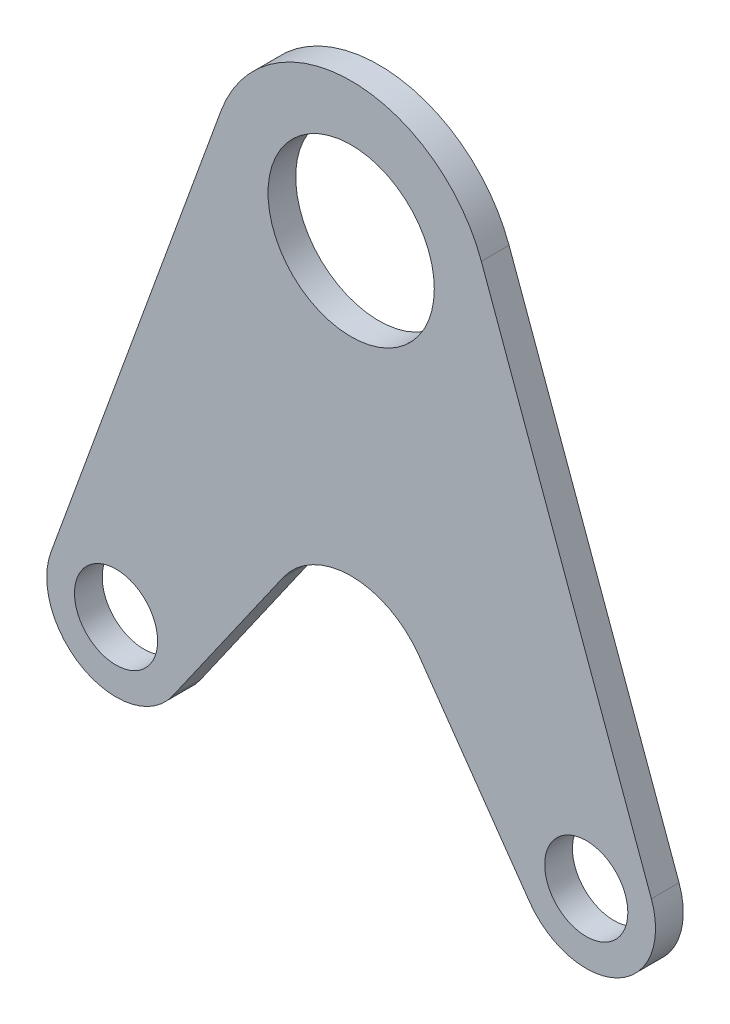
ISO-10303-21;
HEADER;
FILE_DESCRIPTION(('STEP AP214'),'2;1');
FILE_NAME('part.step','',(''),(''),'','','');
FILE_SCHEMA(('AUTOMOTIVE_DESIGN { 1 0 10303 214 1 1 1 1 }'));
ENDSEC;
DATA;
#1=APPLICATION_CONTEXT('core data for automotive mechanical design processes');
#2=APPLICATION_PROTOCOL_DEFINITION('international standard','automotive_design',2000,#1);
#3=PRODUCT_CONTEXT('',#1,'mechanical');
#4=PRODUCT('Part','Part','',(#3));
#5=PRODUCT_RELATED_PRODUCT_CATEGORY('part','',(#4));
#6=PRODUCT_DEFINITION_FORMATION('','',#4);
#7=PRODUCT_DEFINITION_CONTEXT('part definition',#1,'design');
#8=PRODUCT_DEFINITION('design','',#6,#7);
#9=PRODUCT_DEFINITION_SHAPE('','',#8);
#10=(LENGTH_UNIT() NAMED_UNIT(*) SI_UNIT(.MILLI.,.METRE.));
#11=(NAMED_UNIT(*) PLANE_ANGLE_UNIT() SI_UNIT($,.RADIAN.));
#12=(NAMED_UNIT(*) SI_UNIT($,.STERADIAN.) SOLID_ANGLE_UNIT());
#13=UNCERTAINTY_MEASURE_WITH_UNIT(LENGTH_MEASURE(1.E-05),#10,'distance_accuracy_value','');
#14=(GEOMETRIC_REPRESENTATION_CONTEXT(3) GLOBAL_UNCERTAINTY_ASSIGNED_CONTEXT((#13)) GLOBAL_UNIT_ASSIGNED_CONTEXT((#10,
#11,#12)) REPRESENTATION_CONTEXT('',''));
#15=CARTESIAN_POINT('',(0.,0.,0.));
#16=DIRECTION('',(0.,0.,1.));
#17=DIRECTION('',(1.,0.,0.));
#18=AXIS2_PLACEMENT_3D('',#15,#16,#17);
#19=CARTESIAN_POINT('',(0.,0.,10.));
#20=DIRECTION('',(0.,0.,1.));
#21=DIRECTION('',(1.,0.,0.));
#22=AXIS2_PLACEMENT_3D('',#19,#20,#21);
#23=PLANE('',#22);
#24=CARTESIAN_POINT('',(-84.8396817944896,-160.,10.));
#25=DIRECTION('',(0.,0.,1.));
#26=DIRECTION('',(1.,0.,0.));
#27=AXIS2_PLACEMENT_3D('',#24,#25,#26);
#28=CIRCLE('',#27,14.9999999999997);
#29=CARTESIAN_POINT('',(-69.8396817944899,-160.,10.));
#30=VERTEX_POINT('',#29);
#31=EDGE_CURVE('E182',#30,#30,#28,.T.);
#32=ORIENTED_EDGE('',*,*,#31,.F.);
#33=EDGE_LOOP('',(#32));
#34=FACE_BOUND('',#33,.T.);
#35=CARTESIAN_POINT('',(0.,0.,10.));
#36=DIRECTION('',(0.,0.,1.));
#37=DIRECTION('',(1.,0.,0.));
#38=AXIS2_PLACEMENT_3D('',#35,#36,#37);
#39=CIRCLE('',#38,50.);
#40=CARTESIAN_POINT('',(46.9846310392954,17.1010071662835,10.));
#41=VERTEX_POINT('',#40);
#42=CARTESIAN_POINT('',(-46.9846310392955,17.1010071662834,10.));
#43=VERTEX_POINT('',#42);
#44=EDGE_CURVE('E145',#41,#43,#39,.T.);
#45=ORIENTED_EDGE('',*,*,#44,.T.);
#46=DIRECTION('',(-0.342020143325666,-0.939692620785909,0.));
#47=VECTOR('',#46,1.);
#48=CARTESIAN_POINT('',(-46.9846310392955,17.1010071662834,10.));
#49=LINE('',#48,#47);
#50=CARTESIAN_POINT('',(-108.331997314137,-151.449496416858,10.));
#51=VERTEX_POINT('',#50);
#52=EDGE_CURVE('E93',#43,#51,#49,.T.);
#53=ORIENTED_EDGE('',*,*,#52,.T.);
#54=CARTESIAN_POINT('',(-84.8396817944896,-160.,10.));
#55=DIRECTION('',(0.,0.,1.));
#56=DIRECTION('',(1.,0.,0.));
#57=AXIS2_PLACEMENT_3D('',#54,#55,#56);
#58=CIRCLE('',#57,25.);
#59=CARTESIAN_POINT('',(-64.3608806872648,-174.339410908776,10.));
#60=VERTEX_POINT('',#59);
#61=EDGE_CURVE('E160',#51,#60,#58,.T.);
#62=ORIENTED_EDGE('',*,*,#61,.T.);
#63=DIRECTION('',(0.573576436351041,0.819152044288995,0.));
#64=VECTOR('',#63,1.);
#65=CARTESIAN_POINT('',(-64.3608806872648,-174.339410908776,10.));
#66=LINE('',#65,#64);
#67=CARTESIAN_POINT('',(-24.5745613286698,-117.518658221193,10.));
#68=VERTEX_POINT('',#67);
#69=EDGE_CURVE('E173',#60,#68,#66,.T.);
#70=ORIENTED_EDGE('',*,*,#69,.T.);
#71=CARTESIAN_POINT('',(0.,-134.725951311724,10.));
#72=DIRECTION('',(0.,0.,-1.));
#73=DIRECTION('',(-1.,0.,0.));
#74=AXIS2_PLACEMENT_3D('',#71,#72,#73);
#75=CIRCLE('',#74,30.);
#76=CARTESIAN_POINT('',(24.5745613286697,-117.518658221193,10.));
#77=VERTEX_POINT('',#76);
#78=EDGE_CURVE('E112',#68,#77,#75,.T.);
#79=ORIENTED_EDGE('',*,*,#78,.T.);
#80=DIRECTION('',(0.573576436351047,-0.819152044288991,0.));
#81=VECTOR('',#80,1.);
#82=CARTESIAN_POINT('',(24.5745613286697,-117.518658221193,10.));
#83=LINE('',#82,#81);
#84=CARTESIAN_POINT('',(64.3608806872656,-174.339410908776,10.));
#85=VERTEX_POINT('',#84);
#86=EDGE_CURVE('E106',#77,#85,#83,.T.);
#87=ORIENTED_EDGE('',*,*,#86,.T.);
#88=CARTESIAN_POINT('',(84.8396817944903,-160.,10.));
#89=DIRECTION('',(0.,0.,1.));
#90=DIRECTION('',(1.,0.,0.));
#91=AXIS2_PLACEMENT_3D('',#88,#89,#90);
#92=CIRCLE('',#91,25.);
#93=CARTESIAN_POINT('',(108.331997314138,-151.449496416858,10.));
#94=VERTEX_POINT('',#93);
#95=EDGE_CURVE('E110',#85,#94,#92,.T.);
#96=ORIENTED_EDGE('',*,*,#95,.T.);
#97=DIRECTION('',(-0.342020143325669,0.939692620785908,0.));
#98=VECTOR('',#97,1.);
#99=CARTESIAN_POINT('',(46.9846310392954,17.1010071662835,10.));
#100=LINE('',#99,#98);
#101=EDGE_CURVE('E50',#94,#41,#100,.T.);
#102=ORIENTED_EDGE('',*,*,#101,.T.);
#103=EDGE_LOOP('',(#45,#53,#62,#70,#79,#87,#96,#102));
#104=FACE_BOUND('',#103,.T.);
#105=CARTESIAN_POINT('',(0.,0.,10.));
#106=DIRECTION('',(0.,0.,1.));
#107=DIRECTION('',(1.,0.,0.));
#108=AXIS2_PLACEMENT_3D('',#105,#106,#107);
#109=CIRCLE('',#108,30.);
#110=CARTESIAN_POINT('',(30.,0.,10.));
#111=VERTEX_POINT('',#110);
#112=EDGE_CURVE('E134',#111,#111,#109,.T.);
#113=ORIENTED_EDGE('',*,*,#112,.F.);
#114=EDGE_LOOP('',(#113));
#115=FACE_BOUND('',#114,.T.);
#116=CARTESIAN_POINT('',(84.8396817944903,-160.,10.));
#117=DIRECTION('',(0.,0.,1.));
#118=DIRECTION('',(1.,0.,0.));
#119=AXIS2_PLACEMENT_3D('',#116,#117,#118);
#120=CIRCLE('',#119,15.);
#121=CARTESIAN_POINT('',(99.8396817944903,-160.,10.));
#122=VERTEX_POINT('',#121);
#123=EDGE_CURVE('E188',#122,#122,#120,.T.);
#124=ORIENTED_EDGE('',*,*,#123,.F.);
#125=EDGE_LOOP('',(#124));
#126=FACE_BOUND('',#125,.T.);
#127=ADVANCED_FACE('F33',(#34,#104,#115,#126),#23,.T.);
#128=CARTESIAN_POINT('',(0.,0.,0.));
#129=DIRECTION('',(0.,0.,1.));
#130=DIRECTION('',(1.,0.,0.));
#131=AXIS2_PLACEMENT_3D('',#128,#129,#130);
#132=PLANE('',#131);
#133=CARTESIAN_POINT('',(0.,0.,0.));
#134=DIRECTION('',(0.,0.,1.));
#135=DIRECTION('',(1.,0.,0.));
#136=AXIS2_PLACEMENT_3D('',#133,#134,#135);
#137=CIRCLE('',#136,50.);
#138=CARTESIAN_POINT('',(46.9846310392954,17.1010071662835,0.));
#139=VERTEX_POINT('',#138);
#140=CARTESIAN_POINT('',(-46.9846310392955,17.1010071662834,0.));
#141=VERTEX_POINT('',#140);
#142=EDGE_CURVE('E130',#139,#141,#137,.T.);
#143=ORIENTED_EDGE('',*,*,#142,.F.);
#144=DIRECTION('',(-0.342020143325669,0.939692620785908,0.));
#145=VECTOR('',#144,1.);
#146=CARTESIAN_POINT('',(46.9846310392954,17.1010071662835,0.));
#147=LINE('',#146,#145);
#148=CARTESIAN_POINT('',(108.331997314138,-151.449496416858,0.));
#149=VERTEX_POINT('',#148);
#150=EDGE_CURVE('E85',#149,#139,#147,.T.);
#151=ORIENTED_EDGE('',*,*,#150,.F.);
#152=CARTESIAN_POINT('',(84.8396817944903,-160.,0.));
#153=DIRECTION('',(0.,0.,1.));
#154=DIRECTION('',(1.,0.,0.));
#155=AXIS2_PLACEMENT_3D('',#152,#153,#154);
#156=CIRCLE('',#155,25.);
#157=CARTESIAN_POINT('',(64.3608806872656,-174.339410908776,0.));
#158=VERTEX_POINT('',#157);
#159=EDGE_CURVE('E79',#158,#149,#156,.T.);
#160=ORIENTED_EDGE('',*,*,#159,.F.);
#161=DIRECTION('',(0.573576436351047,-0.819152044288991,0.));
#162=VECTOR('',#161,1.);
#163=CARTESIAN_POINT('',(24.5745613286697,-117.518658221193,0.));
#164=LINE('',#163,#162);
#165=CARTESIAN_POINT('',(24.5745613286697,-117.518658221193,0.));
#166=VERTEX_POINT('',#165);
#167=EDGE_CURVE('E120',#166,#158,#164,.T.);
#168=ORIENTED_EDGE('',*,*,#167,.F.);
#169=CARTESIAN_POINT('',(0.,-134.725951311724,0.));
#170=DIRECTION('',(0.,0.,-1.));
#171=DIRECTION('',(-1.,0.,0.));
#172=AXIS2_PLACEMENT_3D('',#169,#170,#171);
#173=CIRCLE('',#172,30.);
#174=CARTESIAN_POINT('',(-24.5745613286698,-117.518658221193,0.));
#175=VERTEX_POINT('',#174);
#176=EDGE_CURVE('E140',#175,#166,#173,.T.);
#177=ORIENTED_EDGE('',*,*,#176,.F.);
#178=DIRECTION('',(0.573576436351041,0.819152044288995,0.));
#179=VECTOR('',#178,1.);
#180=CARTESIAN_POINT('',(-64.3608806872648,-174.339410908776,0.));
#181=LINE('',#180,#179);
#182=CARTESIAN_POINT('',(-64.3608806872648,-174.339410908776,0.));
#183=VERTEX_POINT('',#182);
#184=EDGE_CURVE('E138',#183,#175,#181,.T.);
#185=ORIENTED_EDGE('',*,*,#184,.F.);
#186=CARTESIAN_POINT('',(-84.8396817944896,-160.,0.));
#187=DIRECTION('',(0.,0.,1.));
#188=DIRECTION('',(1.,0.,0.));
#189=AXIS2_PLACEMENT_3D('',#186,#187,#188);
#190=CIRCLE('',#189,25.);
#191=CARTESIAN_POINT('',(-108.331997314137,-151.449496416858,0.));
#192=VERTEX_POINT('',#191);
#193=EDGE_CURVE('E136',#192,#183,#190,.T.);
#194=ORIENTED_EDGE('',*,*,#193,.F.);
#195=DIRECTION('',(-0.342020143325666,-0.939692620785909,0.));
#196=VECTOR('',#195,1.);
#197=CARTESIAN_POINT('',(-46.9846310392955,17.1010071662834,0.));
#198=LINE('',#197,#196);
#199=EDGE_CURVE('E133',#141,#192,#198,.T.);
#200=ORIENTED_EDGE('',*,*,#199,.F.);
#201=EDGE_LOOP('',(#143,#151,#160,#168,#177,#185,#194,#200));
#202=FACE_BOUND('',#201,.T.);
#203=CARTESIAN_POINT('',(0.,0.,0.));
#204=DIRECTION('',(0.,0.,1.));
#205=DIRECTION('',(1.,0.,0.));
#206=AXIS2_PLACEMENT_3D('',#203,#204,#205);
#207=CIRCLE('',#206,30.);
#208=CARTESIAN_POINT('',(30.,0.,0.));
#209=VERTEX_POINT('',#208);
#210=EDGE_CURVE('E179',#209,#209,#207,.T.);
#211=ORIENTED_EDGE('',*,*,#210,.T.);
#212=EDGE_LOOP('',(#211));
#213=FACE_BOUND('',#212,.T.);
#214=CARTESIAN_POINT('',(-84.8396817944896,-160.,0.));
#215=DIRECTION('',(0.,0.,1.));
#216=DIRECTION('',(1.,0.,0.));
#217=AXIS2_PLACEMENT_3D('',#214,#215,#216);
#218=CIRCLE('',#217,14.9999999999997);
#219=CARTESIAN_POINT('',(-69.8396817944899,-160.,0.));
#220=VERTEX_POINT('',#219);
#221=EDGE_CURVE('E185',#220,#220,#218,.T.);
#222=ORIENTED_EDGE('',*,*,#221,.T.);
#223=EDGE_LOOP('',(#222));
#224=FACE_BOUND('',#223,.T.);
#225=CARTESIAN_POINT('',(84.8396817944903,-160.,0.));
#226=DIRECTION('',(0.,0.,1.));
#227=DIRECTION('',(1.,0.,0.));
#228=AXIS2_PLACEMENT_3D('',#225,#226,#227);
#229=CIRCLE('',#228,15.);
#230=CARTESIAN_POINT('',(99.8396817944903,-160.,0.));
#231=VERTEX_POINT('',#230);
#232=EDGE_CURVE('E191',#231,#231,#229,.T.);
#233=ORIENTED_EDGE('',*,*,#232,.T.);
#234=EDGE_LOOP('',(#233));
#235=FACE_BOUND('',#234,.T.);
#236=ADVANCED_FACE('F164',(#202,#213,#224,#235),#132,.F.);
#237=CARTESIAN_POINT('',(0.,0.,10.));
#238=DIRECTION('',(0.,0.,-1.));
#239=DIRECTION('',(-1.,0.,0.));
#240=AXIS2_PLACEMENT_3D('',#237,#238,#239);
#241=CYLINDRICAL_SURFACE('',#240,50.);
#242=ORIENTED_EDGE('',*,*,#142,.T.);
#243=DIRECTION('',(0.,0.,-1.));
#244=VECTOR('',#243,1.);
#245=CARTESIAN_POINT('',(-46.9846310392955,17.1010071662834,10.));
#246=LINE('',#245,#244);
#247=EDGE_CURVE('E11',#43,#141,#246,.T.);
#248=ORIENTED_EDGE('',*,*,#247,.F.);
#249=ORIENTED_EDGE('',*,*,#44,.F.);
#250=DIRECTION('',(0.,0.,-1.));
#251=VECTOR('',#250,1.);
#252=CARTESIAN_POINT('',(46.9846310392954,17.1010071662835,10.));
#253=LINE('',#252,#251);
#254=EDGE_CURVE('E126',#41,#139,#253,.T.);
#255=ORIENTED_EDGE('',*,*,#254,.T.);
#256=EDGE_LOOP('',(#242,#248,#249,#255));
#257=FACE_BOUND('',#256,.T.);
#258=ADVANCED_FACE('F35',(#257),#241,.T.);
#259=CARTESIAN_POINT('',(-46.9846310392955,17.1010071662834,10.));
#260=DIRECTION('',(0.939692620785909,-0.342020143325666,0.));
#261=DIRECTION('',(0.342020143325666,0.939692620785909,0.));
#262=AXIS2_PLACEMENT_3D('',#259,#260,#261);
#263=PLANE('',#262);
#264=ORIENTED_EDGE('',*,*,#199,.T.);
#265=DIRECTION('',(0.,0.,-1.));
#266=VECTOR('',#265,1.);
#267=CARTESIAN_POINT('',(-108.331997314137,-151.449496416858,10.));
#268=LINE('',#267,#266);
#269=EDGE_CURVE('E42',#51,#192,#268,.T.);
#270=ORIENTED_EDGE('',*,*,#269,.F.);
#271=ORIENTED_EDGE('',*,*,#52,.F.);
#272=ORIENTED_EDGE('',*,*,#247,.T.);
#273=EDGE_LOOP('',(#264,#270,#271,#272));
#274=FACE_BOUND('',#273,.T.);
#275=ADVANCED_FACE('F224',(#274),#263,.F.);
#276=CARTESIAN_POINT('',(-84.8396817944896,-160.,10.));
#277=DIRECTION('',(0.,0.,-1.));
#278=DIRECTION('',(-1.,0.,0.));
#279=AXIS2_PLACEMENT_3D('',#276,#277,#278);
#280=CYLINDRICAL_SURFACE('',#279,25.);
#281=ORIENTED_EDGE('',*,*,#193,.T.);
#282=DIRECTION('',(0.,0.,-1.));
#283=VECTOR('',#282,1.);
#284=CARTESIAN_POINT('',(-64.3608806872648,-174.339410908776,10.));
#285=LINE('',#284,#283);
#286=EDGE_CURVE('E152',#60,#183,#285,.T.);
#287=ORIENTED_EDGE('',*,*,#286,.F.);
#288=ORIENTED_EDGE('',*,*,#61,.F.);
#289=ORIENTED_EDGE('',*,*,#269,.T.);
#290=EDGE_LOOP('',(#281,#287,#288,#289));
#291=FACE_BOUND('',#290,.T.);
#292=ADVANCED_FACE('F158',(#291),#280,.T.);
#293=CARTESIAN_POINT('',(-64.3608806872648,-174.339410908776,10.));
#294=DIRECTION('',(-0.819152044288995,0.573576436351041,0.));
#295=DIRECTION('',(-0.573576436351041,-0.819152044288995,0.));
#296=AXIS2_PLACEMENT_3D('',#293,#294,#295);
#297=PLANE('',#296);
#298=ORIENTED_EDGE('',*,*,#184,.T.);
#299=DIRECTION('',(0.,0.,-1.));
#300=VECTOR('',#299,1.);
#301=CARTESIAN_POINT('',(-24.5745613286698,-117.518658221193,10.));
#302=LINE('',#301,#300);
#303=EDGE_CURVE('E149',#68,#175,#302,.T.);
#304=ORIENTED_EDGE('',*,*,#303,.F.);
#305=ORIENTED_EDGE('',*,*,#69,.F.);
#306=ORIENTED_EDGE('',*,*,#286,.T.);
#307=EDGE_LOOP('',(#298,#304,#305,#306));
#308=FACE_BOUND('',#307,.T.);
#309=ADVANCED_FACE('F169',(#308),#297,.F.);
#310=CARTESIAN_POINT('',(0.,-134.725951311724,10.));
#311=DIRECTION('',(0.,0.,-1.));
#312=DIRECTION('',(-1.,0.,0.));
#313=AXIS2_PLACEMENT_3D('',#310,#311,#312);
#314=CYLINDRICAL_SURFACE('',#313,30.);
#315=ORIENTED_EDGE('',*,*,#176,.T.);
#316=DIRECTION('',(0.,0.,-1.));
#317=VECTOR('',#316,1.);
#318=CARTESIAN_POINT('',(24.5745613286697,-117.518658221193,10.));
#319=LINE('',#318,#317);
#320=EDGE_CURVE('E121',#77,#166,#319,.T.);
#321=ORIENTED_EDGE('',*,*,#320,.F.);
#322=ORIENTED_EDGE('',*,*,#78,.F.);
#323=ORIENTED_EDGE('',*,*,#303,.T.);
#324=EDGE_LOOP('',(#315,#321,#322,#323));
#325=FACE_BOUND('',#324,.T.);
#326=ADVANCED_FACE('F172',(#325),#314,.F.);
#327=CARTESIAN_POINT('',(24.5745613286697,-117.518658221193,10.));
#328=DIRECTION('',(0.819152044288991,0.573576436351047,0.));
#329=DIRECTION('',(-0.573576436351047,0.819152044288991,0.));
#330=AXIS2_PLACEMENT_3D('',#327,#328,#329);
#331=PLANE('',#330);
#332=ORIENTED_EDGE('',*,*,#167,.T.);
#333=DIRECTION('',(0.,0.,-1.));
#334=VECTOR('',#333,1.);
#335=CARTESIAN_POINT('',(64.3608806872656,-174.339410908776,10.));
#336=LINE('',#335,#334);
#337=EDGE_CURVE('E117',#85,#158,#336,.T.);
#338=ORIENTED_EDGE('',*,*,#337,.F.);
#339=ORIENTED_EDGE('',*,*,#86,.F.);
#340=ORIENTED_EDGE('',*,*,#320,.T.);
#341=EDGE_LOOP('',(#332,#338,#339,#340));
#342=FACE_BOUND('',#341,.T.);
#343=ADVANCED_FACE('F118',(#342),#331,.F.);
#344=CARTESIAN_POINT('',(84.8396817944903,-160.,10.));
#345=DIRECTION('',(0.,0.,-1.));
#346=DIRECTION('',(-1.,0.,0.));
#347=AXIS2_PLACEMENT_3D('',#344,#345,#346);
#348=CYLINDRICAL_SURFACE('',#347,25.);
#349=ORIENTED_EDGE('',*,*,#159,.T.);
#350=DIRECTION('',(0.,0.,-1.));
#351=VECTOR('',#350,1.);
#352=CARTESIAN_POINT('',(108.331997314138,-151.449496416858,10.));
#353=LINE('',#352,#351);
#354=EDGE_CURVE('E122',#94,#149,#353,.T.);
#355=ORIENTED_EDGE('',*,*,#354,.F.);
#356=ORIENTED_EDGE('',*,*,#95,.F.);
#357=ORIENTED_EDGE('',*,*,#337,.T.);
#358=EDGE_LOOP('',(#349,#355,#356,#357));
#359=FACE_BOUND('',#358,.T.);
#360=ADVANCED_FACE('F124',(#359),#348,.T.);
#361=CARTESIAN_POINT('',(46.9846310392954,17.1010071662835,10.));
#362=DIRECTION('',(-0.939692620785908,-0.342020143325669,0.));
#363=DIRECTION('',(0.342020143325669,-0.939692620785908,0.));
#364=AXIS2_PLACEMENT_3D('',#361,#362,#363);
#365=PLANE('',#364);
#366=ORIENTED_EDGE('',*,*,#150,.T.);
#367=ORIENTED_EDGE('',*,*,#254,.F.);
#368=ORIENTED_EDGE('',*,*,#101,.F.);
#369=ORIENTED_EDGE('',*,*,#354,.T.);
#370=EDGE_LOOP('',(#366,#367,#368,#369));
#371=FACE_BOUND('',#370,.T.);
#372=ADVANCED_FACE('F212',(#371),#365,.F.);
#373=CARTESIAN_POINT('',(0.,0.,10.));
#374=DIRECTION('',(0.,0.,-1.));
#375=DIRECTION('',(-1.,0.,0.));
#376=AXIS2_PLACEMENT_3D('',#373,#374,#375);
#377=CYLINDRICAL_SURFACE('',#376,30.);
#378=ORIENTED_EDGE('',*,*,#112,.T.);
#379=EDGE_LOOP('',(#378));
#380=FACE_BOUND('',#379,.T.);
#381=ORIENTED_EDGE('',*,*,#210,.F.);
#382=EDGE_LOOP('',(#381));
#383=FACE_BOUND('',#382,.T.);
#384=ADVANCED_FACE('F209',(#380,#383),#377,.F.);
#385=CARTESIAN_POINT('',(-84.8396817944896,-160.,10.));
#386=DIRECTION('',(0.,0.,-1.));
#387=DIRECTION('',(-1.,0.,0.));
#388=AXIS2_PLACEMENT_3D('',#385,#386,#387);
#389=CYLINDRICAL_SURFACE('',#388,14.9999999999997);
#390=ORIENTED_EDGE('',*,*,#31,.T.);
#391=EDGE_LOOP('',(#390));
#392=FACE_BOUND('',#391,.T.);
#393=ORIENTED_EDGE('',*,*,#221,.F.);
#394=EDGE_LOOP('',(#393));
#395=FACE_BOUND('',#394,.T.);
#396=ADVANCED_FACE('F288',(#392,#395),#389,.F.);
#397=CARTESIAN_POINT('',(84.8396817944903,-160.,10.));
#398=DIRECTION('',(0.,0.,-1.));
#399=DIRECTION('',(-1.,0.,0.));
#400=AXIS2_PLACEMENT_3D('',#397,#398,#399);
#401=CYLINDRICAL_SURFACE('',#400,15.);
#402=ORIENTED_EDGE('',*,*,#123,.T.);
#403=EDGE_LOOP('',(#402));
#404=FACE_BOUND('',#403,.T.);
#405=ORIENTED_EDGE('',*,*,#232,.F.);
#406=EDGE_LOOP('',(#405));
#407=FACE_BOUND('',#406,.T.);
#408=ADVANCED_FACE('F197',(#404,#407),#401,.F.);
#409=CLOSED_SHELL('',(#127,#236,#258,#275,#292,#309,#326,#343,#360,#372,#384,#396,#408));
#410=MANIFOLD_SOLID_BREP('B2',#409);
#411=ADVANCED_BREP_SHAPE_REPRESENTATION('',(#18,#410),#14);
#412=SHAPE_DEFINITION_REPRESENTATION(#9,#411);
ENDSEC;
END-ISO-10303-21;
